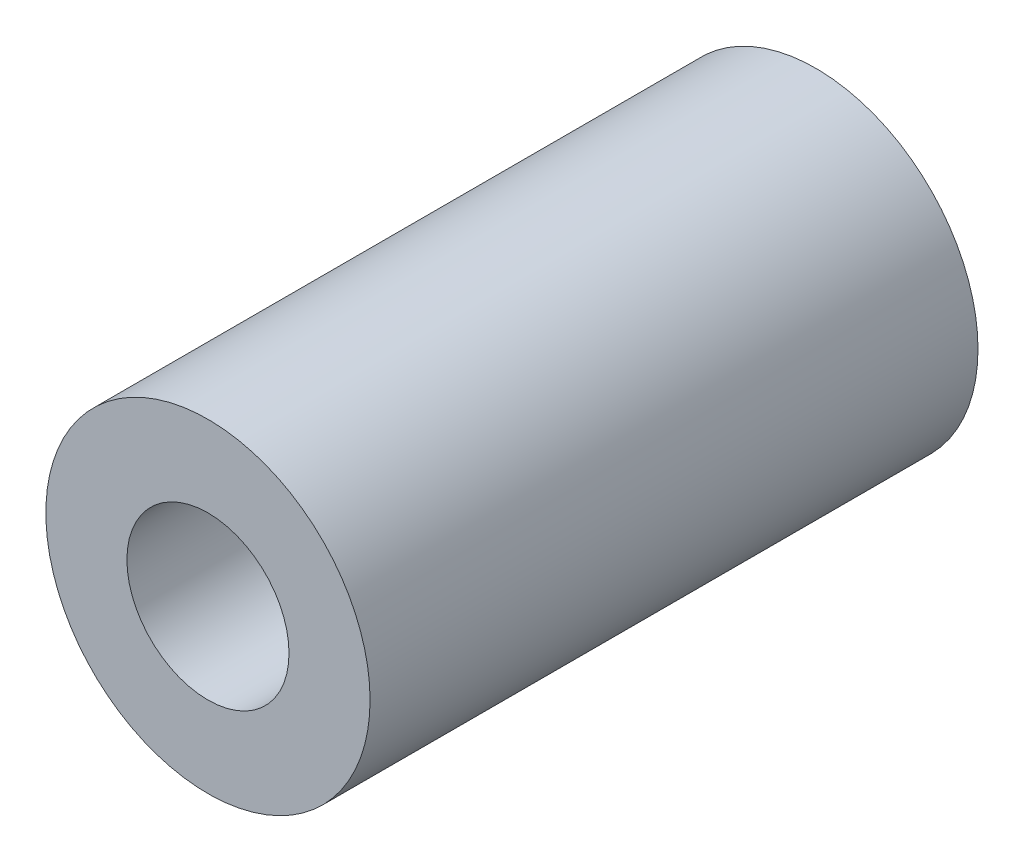
ISO-10303-21;
HEADER;
FILE_DESCRIPTION(('STEP AP214'),'2;1');
FILE_NAME('part.step','',(''),(''),'','','');
FILE_SCHEMA(('AUTOMOTIVE_DESIGN { 1 0 10303 214 1 1 1 1 }'));
ENDSEC;
DATA;
#1=APPLICATION_CONTEXT('core data for automotive mechanical design processes');
#2=APPLICATION_PROTOCOL_DEFINITION('international standard','automotive_design',2000,#1);
#3=PRODUCT_CONTEXT('',#1,'mechanical');
#4=PRODUCT('Part','Part','',(#3));
#5=PRODUCT_RELATED_PRODUCT_CATEGORY('part','',(#4));
#6=PRODUCT_DEFINITION_FORMATION('','',#4);
#7=PRODUCT_DEFINITION_CONTEXT('part definition',#1,'design');
#8=PRODUCT_DEFINITION('design','',#6,#7);
#9=PRODUCT_DEFINITION_SHAPE('','',#8);
#10=(LENGTH_UNIT() NAMED_UNIT(*) SI_UNIT(.MILLI.,.METRE.));
#11=(NAMED_UNIT(*) PLANE_ANGLE_UNIT() SI_UNIT($,.RADIAN.));
#12=(NAMED_UNIT(*) SI_UNIT($,.STERADIAN.) SOLID_ANGLE_UNIT());
#13=UNCERTAINTY_MEASURE_WITH_UNIT(LENGTH_MEASURE(1.E-05),#10,'distance_accuracy_value','');
#14=(GEOMETRIC_REPRESENTATION_CONTEXT(3) GLOBAL_UNCERTAINTY_ASSIGNED_CONTEXT((#13)) GLOBAL_UNIT_ASSIGNED_CONTEXT((#10,
#11,#12)) REPRESENTATION_CONTEXT('',''));
#15=CARTESIAN_POINT('',(0.,0.,0.));
#16=DIRECTION('',(0.,0.,1.));
#17=DIRECTION('',(1.,0.,0.));
#18=AXIS2_PLACEMENT_3D('',#15,#16,#17);
#19=CARTESIAN_POINT('',(0.,0.,7.5));
#20=DIRECTION('',(0.,0.,1.));
#21=DIRECTION('',(1.,0.,0.));
#22=AXIS2_PLACEMENT_3D('',#19,#20,#21);
#23=PLANE('',#22);
#24=CARTESIAN_POINT('',(0.,0.,7.5));
#25=DIRECTION('',(0.,0.,1.));
#26=DIRECTION('',(1.,0.,0.));
#27=AXIS2_PLACEMENT_3D('',#24,#25,#26);
#28=CIRCLE('',#27,4.);
#29=CARTESIAN_POINT('',(4.,0.,7.5));
#30=VERTEX_POINT('',#29);
#31=EDGE_CURVE('E10',#30,#30,#28,.T.);
#32=ORIENTED_EDGE('',*,*,#31,.T.);
#33=EDGE_LOOP('',(#32));
#34=FACE_BOUND('',#33,.T.);
#35=CARTESIAN_POINT('',(0.,0.,7.5));
#36=DIRECTION('',(0.,0.,1.));
#37=DIRECTION('',(1.,0.,0.));
#38=AXIS2_PLACEMENT_3D('',#35,#36,#37);
#39=CIRCLE('',#38,2.);
#40=CARTESIAN_POINT('',(2.,0.,7.5));
#41=VERTEX_POINT('',#40);
#42=EDGE_CURVE('E42',#41,#41,#39,.T.);
#43=ORIENTED_EDGE('',*,*,#42,.F.);
#44=EDGE_LOOP('',(#43));
#45=FACE_BOUND('',#44,.T.);
#46=ADVANCED_FACE('F31',(#34,#45),#23,.T.);
#47=CARTESIAN_POINT('',(0.,0.,-7.5));
#48=DIRECTION('',(0.,0.,1.));
#49=DIRECTION('',(1.,0.,0.));
#50=AXIS2_PLACEMENT_3D('',#47,#48,#49);
#51=PLANE('',#50);
#52=CARTESIAN_POINT('',(0.,0.,-7.5));
#53=DIRECTION('',(0.,0.,1.));
#54=DIRECTION('',(1.,0.,0.));
#55=AXIS2_PLACEMENT_3D('',#52,#53,#54);
#56=CIRCLE('',#55,4.);
#57=CARTESIAN_POINT('',(4.,0.,-7.5));
#58=VERTEX_POINT('',#57);
#59=EDGE_CURVE('E35',#58,#58,#56,.T.);
#60=ORIENTED_EDGE('',*,*,#59,.F.);
#61=EDGE_LOOP('',(#60));
#62=FACE_BOUND('',#61,.T.);
#63=CARTESIAN_POINT('',(0.,0.,-7.5));
#64=DIRECTION('',(0.,0.,1.));
#65=DIRECTION('',(1.,0.,0.));
#66=AXIS2_PLACEMENT_3D('',#63,#64,#65);
#67=CIRCLE('',#66,2.);
#68=CARTESIAN_POINT('',(2.,0.,-7.5));
#69=VERTEX_POINT('',#68);
#70=EDGE_CURVE('E44',#69,#69,#67,.T.);
#71=ORIENTED_EDGE('',*,*,#70,.T.);
#72=EDGE_LOOP('',(#71));
#73=FACE_BOUND('',#72,.T.);
#74=ADVANCED_FACE('F54',(#62,#73),#51,.F.);
#75=CARTESIAN_POINT('',(0.,0.,7.5));
#76=DIRECTION('',(0.,0.,-1.));
#77=DIRECTION('',(-1.,0.,0.));
#78=AXIS2_PLACEMENT_3D('',#75,#76,#77);
#79=CYLINDRICAL_SURFACE('',#78,4.);
#80=ORIENTED_EDGE('',*,*,#31,.F.);
#81=EDGE_LOOP('',(#80));
#82=FACE_BOUND('',#81,.T.);
#83=ORIENTED_EDGE('',*,*,#59,.T.);
#84=EDGE_LOOP('',(#83));
#85=FACE_BOUND('',#84,.T.);
#86=ADVANCED_FACE('F33',(#82,#85),#79,.T.);
#87=CARTESIAN_POINT('',(0.,0.,7.5));
#88=DIRECTION('',(0.,0.,-1.));
#89=DIRECTION('',(-1.,0.,0.));
#90=AXIS2_PLACEMENT_3D('',#87,#88,#89);
#91=CYLINDRICAL_SURFACE('',#90,2.);
#92=ORIENTED_EDGE('',*,*,#42,.T.);
#93=EDGE_LOOP('',(#92));
#94=FACE_BOUND('',#93,.T.);
#95=ORIENTED_EDGE('',*,*,#70,.F.);
#96=EDGE_LOOP('',(#95));
#97=FACE_BOUND('',#96,.T.);
#98=ADVANCED_FACE('F50',(#94,#97),#91,.F.);
#99=CLOSED_SHELL('',(#46,#74,#86,#98));
#100=MANIFOLD_SOLID_BREP('B2',#99);
#101=ADVANCED_BREP_SHAPE_REPRESENTATION('',(#18,#100),#14);
#102=SHAPE_DEFINITION_REPRESENTATION(#9,#101);
ENDSEC;
END-ISO-10303-21;
